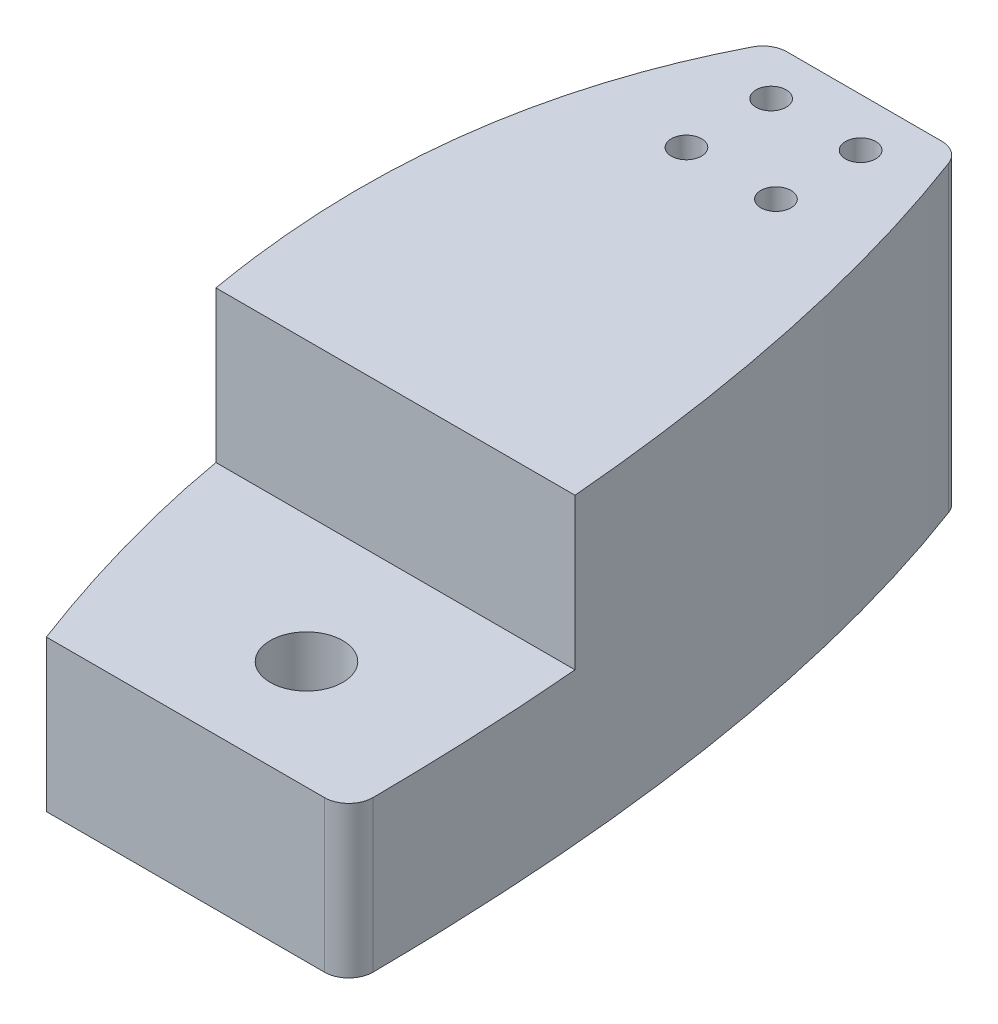
ISO-10303-21;
HEADER;
FILE_DESCRIPTION(('STEP AP214'),'2;1');
FILE_NAME('part.step','',(''),(''),'','','');
FILE_SCHEMA(('AUTOMOTIVE_DESIGN { 1 0 10303 214 1 1 1 1 }'));
ENDSEC;
DATA;
#1=APPLICATION_CONTEXT('core data for automotive mechanical design processes');
#2=APPLICATION_PROTOCOL_DEFINITION('international standard','automotive_design',2000,#1);
#3=PRODUCT_CONTEXT('',#1,'mechanical');
#4=PRODUCT('Part','Part','',(#3));
#5=PRODUCT_RELATED_PRODUCT_CATEGORY('part','',(#4));
#6=PRODUCT_DEFINITION_FORMATION('','',#4);
#7=PRODUCT_DEFINITION_CONTEXT('part definition',#1,'design');
#8=PRODUCT_DEFINITION('design','',#6,#7);
#9=PRODUCT_DEFINITION_SHAPE('','',#8);
#10=(LENGTH_UNIT() NAMED_UNIT(*) SI_UNIT(.MILLI.,.METRE.));
#11=(NAMED_UNIT(*) PLANE_ANGLE_UNIT() SI_UNIT($,.RADIAN.));
#12=(NAMED_UNIT(*) SI_UNIT($,.STERADIAN.) SOLID_ANGLE_UNIT());
#13=UNCERTAINTY_MEASURE_WITH_UNIT(LENGTH_MEASURE(1.E-05),#10,'distance_accuracy_value','');
#14=(GEOMETRIC_REPRESENTATION_CONTEXT(3) GLOBAL_UNCERTAINTY_ASSIGNED_CONTEXT((#13)) GLOBAL_UNIT_ASSIGNED_CONTEXT((#10,
#11,#12)) REPRESENTATION_CONTEXT('',''));
#15=CARTESIAN_POINT('',(0.,0.,0.));
#16=DIRECTION('',(0.,0.,1.));
#17=DIRECTION('',(1.,0.,0.));
#18=AXIS2_PLACEMENT_3D('',#15,#16,#17);
#19=CARTESIAN_POINT('',(0.,0.,0.));
#20=DIRECTION('',(0.,0.,-1.));
#21=DIRECTION('',(-1.,0.,0.));
#22=AXIS2_PLACEMENT_3D('',#19,#20,#21);
#23=PLANE('',#22);
#24=DIRECTION('',(1.,0.,0.));
#25=VECTOR('',#24,1.);
#26=CARTESIAN_POINT('',(-12.5,12.5,0.));
#27=LINE('',#26,#25);
#28=CARTESIAN_POINT('',(-11.2929010343161,12.5,0.));
#29=VERTEX_POINT('',#28);
#30=CARTESIAN_POINT('',(1.50248658975392,12.5,0.));
#31=VERTEX_POINT('',#30);
#32=EDGE_CURVE('E402',#29,#31,#27,.T.);
#33=ORIENTED_EDGE('',*,*,#32,.T.);
#34=DIRECTION('',(0.,-1.,0.));
#35=VECTOR('',#34,1.);
#36=CARTESIAN_POINT('',(1.50248658975392,-12.5,0.));
#37=LINE('',#36,#35);
#38=CARTESIAN_POINT('',(1.50248658975392,-12.5,0.));
#39=VERTEX_POINT('',#38);
#40=EDGE_CURVE('E457',#31,#39,#37,.T.);
#41=ORIENTED_EDGE('',*,*,#40,.T.);
#42=DIRECTION('',(1.,0.,0.));
#43=VECTOR('',#42,1.);
#44=CARTESIAN_POINT('',(-12.5,-12.5,0.));
#45=LINE('',#44,#43);
#46=CARTESIAN_POINT('',(-11.2929010343161,-12.5,0.));
#47=VERTEX_POINT('',#46);
#48=EDGE_CURVE('E418',#47,#39,#45,.T.);
#49=ORIENTED_EDGE('',*,*,#48,.F.);
#50=DIRECTION('',(0.,1.,0.));
#51=VECTOR('',#50,1.);
#52=CARTESIAN_POINT('',(-11.2929010343161,0.,0.));
#53=LINE('',#52,#51);
#54=EDGE_CURVE('E453',#47,#29,#53,.T.);
#55=ORIENTED_EDGE('',*,*,#54,.T.);
#56=EDGE_LOOP('',(#33,#41,#49,#55));
#57=FACE_BOUND('',#56,.T.);
#58=DIRECTION('',(1.,0.,0.));
#59=VECTOR('',#58,1.);
#60=CARTESIAN_POINT('',(0.,8.5,0.));
#61=LINE('',#60,#59);
#62=CARTESIAN_POINT('',(-10.2929010343161,8.5,0.));
#63=VERTEX_POINT('',#62);
#64=CARTESIAN_POINT('',(-6.89520722228111,8.5,0.));
#65=VERTEX_POINT('',#64);
#66=EDGE_CURVE('E319',#63,#65,#61,.T.);
#67=ORIENTED_EDGE('',*,*,#66,.F.);
#68=DIRECTION('',(0.,-1.,0.));
#69=VECTOR('',#68,1.);
#70=CARTESIAN_POINT('',(-10.2929010343161,0.,0.));
#71=LINE('',#70,#69);
#72=CARTESIAN_POINT('',(-10.2929010343161,-8.5,0.));
#73=VERTEX_POINT('',#72);
#74=EDGE_CURVE('E315',#63,#73,#71,.T.);
#75=ORIENTED_EDGE('',*,*,#74,.T.);
#76=DIRECTION('',(1.,0.,0.));
#77=VECTOR('',#76,1.);
#78=CARTESIAN_POINT('',(0.,-8.5,0.));
#79=LINE('',#78,#77);
#80=CARTESIAN_POINT('',(-6.89520722228111,-8.5,0.));
#81=VERTEX_POINT('',#80);
#82=EDGE_CURVE('E303',#73,#81,#79,.T.);
#83=ORIENTED_EDGE('',*,*,#82,.T.);
#84=DIRECTION('',(0.,-1.,0.));
#85=VECTOR('',#84,1.);
#86=CARTESIAN_POINT('',(-6.89520722228111,0.,0.));
#87=LINE('',#86,#85);
#88=EDGE_CURVE('E324',#65,#81,#87,.T.);
#89=ORIENTED_EDGE('',*,*,#88,.F.);
#90=EDGE_LOOP('',(#67,#75,#83,#89));
#91=FACE_BOUND('',#90,.T.);
#92=DIRECTION('',(0.,-1.,0.));
#93=VECTOR('',#92,1.);
#94=CARTESIAN_POINT('',(0.502486589753918,0.,0.));
#95=LINE('',#94,#93);
#96=CARTESIAN_POINT('',(0.502486589753918,8.5,0.));
#97=VERTEX_POINT('',#96);
#98=CARTESIAN_POINT('',(0.502486589753918,-8.5,0.));
#99=VERTEX_POINT('',#98);
#100=EDGE_CURVE('E278',#97,#99,#95,.T.);
#101=ORIENTED_EDGE('',*,*,#100,.F.);
#102=DIRECTION('',(-1.,0.,0.));
#103=VECTOR('',#102,1.);
#104=CARTESIAN_POINT('',(0.,8.5,0.));
#105=LINE('',#104,#103);
#106=CARTESIAN_POINT('',(-2.89520722228112,8.5,0.));
#107=VERTEX_POINT('',#106);
#108=EDGE_CURVE('E248',#97,#107,#105,.T.);
#109=ORIENTED_EDGE('',*,*,#108,.T.);
#110=DIRECTION('',(0.,-1.,0.));
#111=VECTOR('',#110,1.);
#112=CARTESIAN_POINT('',(-2.89520722228112,0.,0.));
#113=LINE('',#112,#111);
#114=CARTESIAN_POINT('',(-2.89520722228112,-8.5,0.));
#115=VERTEX_POINT('',#114);
#116=EDGE_CURVE('E263',#107,#115,#113,.T.);
#117=ORIENTED_EDGE('',*,*,#116,.T.);
#118=DIRECTION('',(-1.,0.,0.));
#119=VECTOR('',#118,1.);
#120=CARTESIAN_POINT('',(0.,-8.5,0.));
#121=LINE('',#120,#119);
#122=EDGE_CURVE('E282',#99,#115,#121,.T.);
#123=ORIENTED_EDGE('',*,*,#122,.F.);
#124=EDGE_LOOP('',(#101,#109,#117,#123));
#125=FACE_BOUND('',#124,.T.);
#126=ADVANCED_FACE('F121',(#57,#91,#125),#23,.T.);
#127=CARTESIAN_POINT('',(-12.5,12.5,60.));
#128=DIRECTION('',(0.,1.,0.));
#129=DIRECTION('',(0.,0.,1.));
#130=AXIS2_PLACEMENT_3D('',#127,#128,#129);
#131=PLANE('',#130);
#132=CARTESIAN_POINT('',(-1.1963603162636,12.5,11.));
#133=DIRECTION('',(0.,1.,0.));
#134=DIRECTION('',(0.,0.,1.));
#135=AXIS2_PLACEMENT_3D('',#132,#133,#134);
#136=CIRCLE('',#135,1.25);
#137=CARTESIAN_POINT('',(-1.1963603162636,12.5,12.25));
#138=VERTEX_POINT('',#137);
#139=EDGE_CURVE('E486',#138,#138,#136,.F.);
#140=ORIENTED_EDGE('',*,*,#139,.T.);
#141=EDGE_LOOP('',(#140));
#142=FACE_BOUND('',#141,.T.);
#143=CARTESIAN_POINT('',(-8.59405412829863,12.5,4.));
#144=DIRECTION('',(0.,1.,0.));
#145=DIRECTION('',(0.,0.,1.));
#146=AXIS2_PLACEMENT_3D('',#143,#144,#145);
#147=CIRCLE('',#146,1.25);
#148=CARTESIAN_POINT('',(-8.59405412829863,12.5,5.25));
#149=VERTEX_POINT('',#148);
#150=EDGE_CURVE('E320',#149,#149,#147,.F.);
#151=ORIENTED_EDGE('',*,*,#150,.T.);
#152=EDGE_LOOP('',(#151));
#153=FACE_BOUND('',#152,.T.);
#154=CARTESIAN_POINT('',(-8.59405412829863,12.5,11.));
#155=DIRECTION('',(0.,1.,0.));
#156=DIRECTION('',(0.,0.,1.));
#157=AXIS2_PLACEMENT_3D('',#154,#155,#156);
#158=CIRCLE('',#157,1.25);
#159=CARTESIAN_POINT('',(-8.59405412829863,12.5,12.25));
#160=VERTEX_POINT('',#159);
#161=EDGE_CURVE('E492',#160,#160,#158,.F.);
#162=ORIENTED_EDGE('',*,*,#161,.T.);
#163=EDGE_LOOP('',(#162));
#164=FACE_BOUND('',#163,.T.);
#165=CARTESIAN_POINT('',(-1.1963603162636,12.5,4.));
#166=DIRECTION('',(0.,1.,0.));
#167=DIRECTION('',(0.,0.,1.));
#168=AXIS2_PLACEMENT_3D('',#165,#166,#167);
#169=CIRCLE('',#168,1.25);
#170=CARTESIAN_POINT('',(-1.1963603162636,12.5,5.25));
#171=VERTEX_POINT('',#170);
#172=EDGE_CURVE('E480',#171,#171,#169,.F.);
#173=ORIENTED_EDGE('',*,*,#172,.T.);
#174=EDGE_LOOP('',(#173));
#175=FACE_BOUND('',#174,.T.);
#176=CARTESIAN_POINT('',(2.87897961386818,12.5,0.));
#177=CARTESIAN_POINT('',(12.5,12.5,24.6971319421463));
#178=CARTESIAN_POINT('',(12.5,12.5,60.));
#179=B_SPLINE_CURVE_WITH_KNOTS('',2,(#176,#177,#178),.UNSPECIFIED.,.F.,.F.,(3,3),(0.,1.),.UNSPECIFIED.);
#180=CARTESIAN_POINT('',(3.37503650721397,12.5,1.29746401756182));
#181=VERTEX_POINT('',#180);
#182=CARTESIAN_POINT('',(11.698102629454,12.5,40.5));
#183=VERTEX_POINT('',#182);
#184=EDGE_CURVE('E366',#181,#183,#179,.T.);
#185=ORIENTED_EDGE('',*,*,#184,.F.);
#186=CARTESIAN_POINT('',(1.50248658975392,12.5,2.));
#187=DIRECTION('',(0.,1.,0.));
#188=DIRECTION('',(0.,0.,1.));
#189=AXIS2_PLACEMENT_3D('',#186,#187,#188);
#190=CIRCLE('',#189,2.);
#191=EDGE_CURVE('E450',#181,#31,#190,.T.);
#192=ORIENTED_EDGE('',*,*,#191,.T.);
#193=ORIENTED_EDGE('',*,*,#32,.F.);
#194=CARTESIAN_POINT('',(-11.2929010343161,12.5,2.));
#195=DIRECTION('',(0.,1.,0.));
#196=DIRECTION('',(0.,0.,1.));
#197=AXIS2_PLACEMENT_3D('',#194,#195,#196);
#198=CIRCLE('',#197,2.);
#199=CARTESIAN_POINT('',(-13.0728961441656,12.5,1.08806940564981));
#200=VERTEX_POINT('',#199);
#201=EDGE_CURVE('E447',#29,#200,#198,.T.);
#202=ORIENTED_EDGE('',*,*,#201,.T.);
#203=CARTESIAN_POINT('',(-12.5,12.5,0.));
#204=CARTESIAN_POINT('',(-25.857752506095,12.5,24.6971319421463));
#205=CARTESIAN_POINT('',(-12.5,12.5,60.));
#206=B_SPLINE_CURVE_WITH_KNOTS('',2,(#203,#204,#205),.UNSPECIFIED.,.F.,.F.,(3,3),(0.,1.),.UNSPECIFIED.);
#207=CARTESIAN_POINT('',(-17.986106002808,12.5,40.5));
#208=VERTEX_POINT('',#207);
#209=EDGE_CURVE('E376',#200,#208,#206,.T.);
#210=ORIENTED_EDGE('',*,*,#209,.T.);
#211=DIRECTION('',(-1.,0.,0.));
#212=VECTOR('',#211,1.);
#213=CARTESIAN_POINT('',(18.7881167987811,12.5,40.5));
#214=LINE('',#213,#212);
#215=EDGE_CURVE('E348',#183,#208,#214,.T.);
#216=ORIENTED_EDGE('',*,*,#215,.F.);
#217=EDGE_LOOP('',(#185,#192,#193,#202,#210,#216));
#218=FACE_BOUND('',#217,.T.);
#219=ADVANCED_FACE('F507',(#142,#153,#164,#175,#218),#131,.T.);
#220=CARTESIAN_POINT('',(-12.5,-12.5,60.));
#221=DIRECTION('',(0.,1.,0.));
#222=DIRECTION('',(0.,0.,1.));
#223=AXIS2_PLACEMENT_3D('',#220,#221,#222);
#224=PLANE('',#223);
#225=CARTESIAN_POINT('',(-1.1963603162636,-12.5,11.));
#226=DIRECTION('',(0.,1.,0.));
#227=DIRECTION('',(0.,0.,1.));
#228=AXIS2_PLACEMENT_3D('',#225,#226,#227);
#229=CIRCLE('',#228,1.25);
#230=CARTESIAN_POINT('',(-1.1963603162636,-12.5,12.25));
#231=VERTEX_POINT('',#230);
#232=EDGE_CURVE('E835',#231,#231,#229,.F.);
#233=ORIENTED_EDGE('',*,*,#232,.F.);
#234=EDGE_LOOP('',(#233));
#235=FACE_BOUND('',#234,.T.);
#236=CARTESIAN_POINT('',(-8.59405412829863,-12.5,4.));
#237=DIRECTION('',(0.,1.,0.));
#238=DIRECTION('',(0.,0.,1.));
#239=AXIS2_PLACEMENT_3D('',#236,#237,#238);
#240=CIRCLE('',#239,1.25);
#241=CARTESIAN_POINT('',(-8.59405412829863,-12.5,5.25));
#242=VERTEX_POINT('',#241);
#243=EDGE_CURVE('E813',#242,#242,#240,.F.);
#244=ORIENTED_EDGE('',*,*,#243,.F.);
#245=EDGE_LOOP('',(#244));
#246=FACE_BOUND('',#245,.T.);
#247=CARTESIAN_POINT('',(-8.59405412829863,-12.5,11.));
#248=DIRECTION('',(0.,1.,0.));
#249=DIRECTION('',(0.,0.,1.));
#250=AXIS2_PLACEMENT_3D('',#247,#248,#249);
#251=CIRCLE('',#250,1.25);
#252=CARTESIAN_POINT('',(-8.59405412829863,-12.5,12.25));
#253=VERTEX_POINT('',#252);
#254=EDGE_CURVE('E825',#253,#253,#251,.F.);
#255=ORIENTED_EDGE('',*,*,#254,.F.);
#256=EDGE_LOOP('',(#255));
#257=FACE_BOUND('',#256,.T.);
#258=CARTESIAN_POINT('',(-1.1963603162636,-12.5,4.));
#259=DIRECTION('',(0.,1.,0.));
#260=DIRECTION('',(0.,0.,1.));
#261=AXIS2_PLACEMENT_3D('',#258,#259,#260);
#262=CIRCLE('',#261,1.25);
#263=CARTESIAN_POINT('',(-1.1963603162636,-12.5,5.25));
#264=VERTEX_POINT('',#263);
#265=EDGE_CURVE('E845',#264,#264,#262,.F.);
#266=ORIENTED_EDGE('',*,*,#265,.F.);
#267=EDGE_LOOP('',(#266));
#268=FACE_BOUND('',#267,.T.);
#269=CARTESIAN_POINT('',(0.,-12.5,51.));
#270=DIRECTION('',(0.,1.,0.));
#271=DIRECTION('',(0.,0.,1.));
#272=AXIS2_PLACEMENT_3D('',#269,#270,#271);
#273=CIRCLE('',#272,3.);
#274=CARTESIAN_POINT('',(0.,-12.5,54.));
#275=VERTEX_POINT('',#274);
#276=EDGE_CURVE('E343',#275,#275,#273,.T.);
#277=ORIENTED_EDGE('',*,*,#276,.T.);
#278=EDGE_LOOP('',(#277));
#279=FACE_BOUND('',#278,.T.);
#280=CARTESIAN_POINT('',(2.87897961386818,-12.5,0.));
#281=CARTESIAN_POINT('',(12.5,-12.5,24.6971319421463));
#282=CARTESIAN_POINT('',(12.5,-12.5,60.));
#283=B_SPLINE_CURVE_WITH_KNOTS('',2,(#280,#281,#282),.UNSPECIFIED.,.F.,.F.,(3,3),(0.,1.),.UNSPECIFIED.);
#284=CARTESIAN_POINT('',(3.37503650721397,-12.5,1.29746401756182));
#285=VERTEX_POINT('',#284);
#286=CARTESIAN_POINT('',(12.4920901269706,-12.5,57.9842362674177));
#287=VERTEX_POINT('',#286);
#288=EDGE_CURVE('E367',#285,#287,#283,.T.);
#289=ORIENTED_EDGE('',*,*,#288,.T.);
#290=CARTESIAN_POINT('',(10.4921522517517,-12.5,58.));
#291=DIRECTION('',(0.,1.,0.));
#292=DIRECTION('',(0.,0.,1.));
#293=AXIS2_PLACEMENT_3D('',#290,#291,#292);
#294=CIRCLE('',#293,2.);
#295=CARTESIAN_POINT('',(10.4921522517517,-12.5,60.));
#296=VERTEX_POINT('',#295);
#297=EDGE_CURVE('E13',#287,#296,#294,.F.);
#298=ORIENTED_EDGE('',*,*,#297,.T.);
#299=DIRECTION('',(1.,0.,0.));
#300=VECTOR('',#299,1.);
#301=CARTESIAN_POINT('',(-12.5,-12.5,60.));
#302=LINE('',#301,#300);
#303=CARTESIAN_POINT('',(-12.5,-12.5,60.));
#304=VERTEX_POINT('',#303);
#305=EDGE_CURVE('E417',#304,#296,#302,.T.);
#306=ORIENTED_EDGE('',*,*,#305,.F.);
#307=CARTESIAN_POINT('',(-12.5,-12.5,0.));
#308=CARTESIAN_POINT('',(-25.857752506095,-12.5,24.6971319421463));
#309=CARTESIAN_POINT('',(-12.5,-12.5,60.));
#310=B_SPLINE_CURVE_WITH_KNOTS('',2,(#307,#308,#309),.UNSPECIFIED.,.F.,.F.,(3,3),(0.,1.),.UNSPECIFIED.);
#311=CARTESIAN_POINT('',(-13.0728961441656,-12.5,1.08806940564982));
#312=VERTEX_POINT('',#311);
#313=EDGE_CURVE('E396',#312,#304,#310,.T.);
#314=ORIENTED_EDGE('',*,*,#313,.F.);
#315=CARTESIAN_POINT('',(-11.2929010343161,-12.5,2.));
#316=DIRECTION('',(0.,1.,0.));
#317=DIRECTION('',(0.,0.,1.));
#318=AXIS2_PLACEMENT_3D('',#315,#316,#317);
#319=CIRCLE('',#318,2.);
#320=EDGE_CURVE('E460',#312,#47,#319,.F.);
#321=ORIENTED_EDGE('',*,*,#320,.T.);
#322=ORIENTED_EDGE('',*,*,#48,.T.);
#323=CARTESIAN_POINT('',(1.50248658975392,-12.5,2.));
#324=DIRECTION('',(0.,1.,0.));
#325=DIRECTION('',(0.,0.,1.));
#326=AXIS2_PLACEMENT_3D('',#323,#324,#325);
#327=CIRCLE('',#326,2.);
#328=EDGE_CURVE('E463',#39,#285,#327,.F.);
#329=ORIENTED_EDGE('',*,*,#328,.T.);
#330=EDGE_LOOP('',(#289,#298,#306,#314,#321,#322,#329));
#331=FACE_BOUND('',#330,.T.);
#332=ADVANCED_FACE('F519',(#235,#246,#257,#268,#279,#331),#224,.F.);
#333=CARTESIAN_POINT('',(0.,0.,60.));
#334=DIRECTION('',(0.,0.,-1.));
#335=DIRECTION('',(-1.,0.,0.));
#336=AXIS2_PLACEMENT_3D('',#333,#334,#335);
#337=PLANE('',#336);
#338=ORIENTED_EDGE('',*,*,#305,.T.);
#339=DIRECTION('',(0.,1.,0.));
#340=VECTOR('',#339,1.);
#341=CARTESIAN_POINT('',(10.4921522517517,0.,60.));
#342=LINE('',#341,#340);
#343=CARTESIAN_POINT('',(10.4921522517517,0.,60.));
#344=VERTEX_POINT('',#343);
#345=EDGE_CURVE('E469',#296,#344,#342,.T.);
#346=ORIENTED_EDGE('',*,*,#345,.T.);
#347=DIRECTION('',(1.,0.,0.));
#348=VECTOR('',#347,1.);
#349=CARTESIAN_POINT('',(18.7881167987811,0.,60.));
#350=LINE('',#349,#348);
#351=CARTESIAN_POINT('',(-12.5,0.,60.));
#352=VERTEX_POINT('',#351);
#353=EDGE_CURVE('E347',#352,#344,#350,.T.);
#354=ORIENTED_EDGE('',*,*,#353,.F.);
#355=DIRECTION('',(0.,1.,0.));
#356=VECTOR('',#355,1.);
#357=CARTESIAN_POINT('',(-12.5,-12.5,60.));
#358=LINE('',#357,#356);
#359=EDGE_CURVE('E410',#304,#352,#358,.T.);
#360=ORIENTED_EDGE('',*,*,#359,.F.);
#361=EDGE_LOOP('',(#338,#346,#354,#360));
#362=FACE_BOUND('',#361,.T.);
#363=ADVANCED_FACE('F393',(#362),#337,.F.);
#364=DIRECTION('',(0.,1.,0.));
#365=VECTOR('',#364,1.);
#366=SURFACE_OF_LINEAR_EXTRUSION('',#310,#365);
#367=ORIENTED_EDGE('',*,*,#209,.F.);
#368=DIRECTION('',(0.,1.,0.));
#369=VECTOR('',#368,1.);
#370=CARTESIAN_POINT('',(-13.0728961441656,12.5,1.08806940564981));
#371=LINE('',#370,#369);
#372=EDGE_CURVE('E466',#200,#312,#371,.F.);
#373=ORIENTED_EDGE('',*,*,#372,.T.);
#374=ORIENTED_EDGE('',*,*,#313,.T.);
#375=ORIENTED_EDGE('',*,*,#359,.T.);
#376=CARTESIAN_POINT('',(-12.5,0.,0.));
#377=CARTESIAN_POINT('',(-25.857752506095,0.,24.6971319421463));
#378=CARTESIAN_POINT('',(-12.5,0.,60.));
#379=B_SPLINE_CURVE_WITH_KNOTS('',2,(#376,#377,#378),.UNSPECIFIED.,.F.,.F.,(3,3),(0.,1.),.UNSPECIFIED.);
#380=CARTESIAN_POINT('',(-17.986106002808,0.,40.5));
#381=VERTEX_POINT('',#380);
#382=EDGE_CURVE('E361',#381,#352,#379,.T.);
#383=ORIENTED_EDGE('',*,*,#382,.F.);
#384=DIRECTION('',(0.,1.,0.));
#385=VECTOR('',#384,1.);
#386=CARTESIAN_POINT('',(-17.986106002808,-12.5,40.5));
#387=LINE('',#386,#385);
#388=EDGE_CURVE('E355',#381,#208,#387,.T.);
#389=ORIENTED_EDGE('',*,*,#388,.T.);
#390=EDGE_LOOP('',(#367,#373,#374,#375,#383,#389));
#391=FACE_BOUND('',#390,.T.);
#392=ADVANCED_FACE('F389',(#391),#366,.T.);
#393=DIRECTION('',(0.,1.,0.));
#394=VECTOR('',#393,1.);
#395=SURFACE_OF_LINEAR_EXTRUSION('',#283,#394);
#396=CARTESIAN_POINT('',(2.87897961386818,0.,0.));
#397=CARTESIAN_POINT('',(12.5,0.,24.6971319421463));
#398=CARTESIAN_POINT('',(12.5,0.,60.));
#399=B_SPLINE_CURVE_WITH_KNOTS('',2,(#396,#397,#398),.UNSPECIFIED.,.F.,.F.,(3,3),(0.,1.),.UNSPECIFIED.);
#400=CARTESIAN_POINT('',(11.698102629454,0.,40.5));
#401=VERTEX_POINT('',#400);
#402=CARTESIAN_POINT('',(12.4920901269706,0.,57.9842362674177));
#403=VERTEX_POINT('',#402);
#404=EDGE_CURVE('E432',#401,#403,#399,.T.);
#405=ORIENTED_EDGE('',*,*,#404,.T.);
#406=DIRECTION('',(0.,1.,0.));
#407=VECTOR('',#406,1.);
#408=CARTESIAN_POINT('',(12.4920901269706,0.,57.9842362674176));
#409=LINE('',#408,#407);
#410=EDGE_CURVE('E130',#403,#287,#409,.F.);
#411=ORIENTED_EDGE('',*,*,#410,.T.);
#412=ORIENTED_EDGE('',*,*,#288,.F.);
#413=DIRECTION('',(0.,1.,0.));
#414=VECTOR('',#413,1.);
#415=CARTESIAN_POINT('',(3.37503650721396,-12.5,1.29746401756181));
#416=LINE('',#415,#414);
#417=EDGE_CURVE('E437',#285,#181,#416,.T.);
#418=ORIENTED_EDGE('',*,*,#417,.T.);
#419=ORIENTED_EDGE('',*,*,#184,.T.);
#420=DIRECTION('',(0.,1.,0.));
#421=VECTOR('',#420,1.);
#422=CARTESIAN_POINT('',(11.698102629454,-12.5,40.5));
#423=LINE('',#422,#421);
#424=EDGE_CURVE('E422',#401,#183,#423,.T.);
#425=ORIENTED_EDGE('',*,*,#424,.F.);
#426=EDGE_LOOP('',(#405,#411,#412,#418,#419,#425));
#427=FACE_BOUND('',#426,.T.);
#428=ADVANCED_FACE('F384',(#427),#395,.F.);
#429=CARTESIAN_POINT('',(18.7881167987811,0.,40.5));
#430=DIRECTION('',(0.,-1.,0.));
#431=DIRECTION('',(1.,0.,0.));
#432=AXIS2_PLACEMENT_3D('',#429,#430,#431);
#433=PLANE('',#432);
#434=CARTESIAN_POINT('',(0.,0.,51.));
#435=DIRECTION('',(0.,-1.,0.));
#436=DIRECTION('',(1.,0.,0.));
#437=AXIS2_PLACEMENT_3D('',#434,#435,#436);
#438=CIRCLE('',#437,3.);
#439=CARTESIAN_POINT('',(3.,0.,51.));
#440=VERTEX_POINT('',#439);
#441=EDGE_CURVE('E292',#440,#440,#438,.T.);
#442=ORIENTED_EDGE('',*,*,#441,.T.);
#443=EDGE_LOOP('',(#442));
#444=FACE_BOUND('',#443,.T.);
#445=ORIENTED_EDGE('',*,*,#353,.T.);
#446=CARTESIAN_POINT('',(10.4921522517517,0.,58.));
#447=DIRECTION('',(0.,-1.,0.));
#448=DIRECTION('',(1.,0.,0.));
#449=AXIS2_PLACEMENT_3D('',#446,#447,#448);
#450=CIRCLE('',#449,2.);
#451=EDGE_CURVE('E144',#344,#403,#450,.F.);
#452=ORIENTED_EDGE('',*,*,#451,.T.);
#453=ORIENTED_EDGE('',*,*,#404,.F.);
#454=DIRECTION('',(1.,0.,0.));
#455=VECTOR('',#454,1.);
#456=CARTESIAN_POINT('',(18.7881167987811,0.,40.5));
#457=LINE('',#456,#455);
#458=EDGE_CURVE('E352',#381,#401,#457,.T.);
#459=ORIENTED_EDGE('',*,*,#458,.F.);
#460=ORIENTED_EDGE('',*,*,#382,.T.);
#461=EDGE_LOOP('',(#445,#452,#453,#459,#460));
#462=FACE_BOUND('',#461,.T.);
#463=ADVANCED_FACE('F388',(#444,#462),#433,.F.);
#464=CARTESIAN_POINT('',(0.,0.,40.5));
#465=DIRECTION('',(0.,0.,1.));
#466=DIRECTION('',(1.,0.,0.));
#467=AXIS2_PLACEMENT_3D('',#464,#465,#466);
#468=PLANE('',#467);
#469=ORIENTED_EDGE('',*,*,#458,.T.);
#470=ORIENTED_EDGE('',*,*,#424,.T.);
#471=ORIENTED_EDGE('',*,*,#215,.T.);
#472=ORIENTED_EDGE('',*,*,#388,.F.);
#473=EDGE_LOOP('',(#469,#470,#471,#472));
#474=FACE_BOUND('',#473,.T.);
#475=ADVANCED_FACE('F505',(#474),#468,.T.);
#476=CARTESIAN_POINT('',(0.,-23.9068454263108,51.));
#477=DIRECTION('',(0.,1.,0.));
#478=DIRECTION('',(0.,0.,1.));
#479=AXIS2_PLACEMENT_3D('',#476,#477,#478);
#480=CYLINDRICAL_SURFACE('',#479,3.);
#481=ORIENTED_EDGE('',*,*,#441,.F.);
#482=EDGE_LOOP('',(#481));
#483=FACE_BOUND('',#482,.T.);
#484=ORIENTED_EDGE('',*,*,#276,.F.);
#485=EDGE_LOOP('',(#484));
#486=FACE_BOUND('',#485,.T.);
#487=ADVANCED_FACE('F539',(#483,#486),#480,.F.);
#488=CARTESIAN_POINT('',(1.50248658975392,0.,2.));
#489=DIRECTION('',(0.,1.,0.));
#490=DIRECTION('',(0.,0.,1.));
#491=AXIS2_PLACEMENT_3D('',#488,#489,#490);
#492=CYLINDRICAL_SURFACE('',#491,2.);
#493=ORIENTED_EDGE('',*,*,#328,.F.);
#494=ORIENTED_EDGE('',*,*,#40,.F.);
#495=ORIENTED_EDGE('',*,*,#191,.F.);
#496=ORIENTED_EDGE('',*,*,#417,.F.);
#497=EDGE_LOOP('',(#493,#494,#495,#496));
#498=FACE_BOUND('',#497,.T.);
#499=ADVANCED_FACE('F526',(#498),#492,.T.);
#500=CARTESIAN_POINT('',(-11.2929010343161,0.,2.));
#501=DIRECTION('',(0.,1.,0.));
#502=DIRECTION('',(0.,0.,1.));
#503=AXIS2_PLACEMENT_3D('',#500,#501,#502);
#504=CYLINDRICAL_SURFACE('',#503,2.);
#505=ORIENTED_EDGE('',*,*,#320,.F.);
#506=ORIENTED_EDGE('',*,*,#372,.F.);
#507=ORIENTED_EDGE('',*,*,#201,.F.);
#508=ORIENTED_EDGE('',*,*,#54,.F.);
#509=EDGE_LOOP('',(#505,#506,#507,#508));
#510=FACE_BOUND('',#509,.T.);
#511=ADVANCED_FACE('F515',(#510),#504,.T.);
#512=CARTESIAN_POINT('',(-10.2929010343161,0.,15.));
#513=DIRECTION('',(1.,0.,0.));
#514=DIRECTION('',(0.,0.,-1.));
#515=AXIS2_PLACEMENT_3D('',#512,#513,#514);
#516=PLANE('',#515);
#517=ORIENTED_EDGE('',*,*,#74,.F.);
#518=DIRECTION('',(0.,0.,-1.));
#519=VECTOR('',#518,1.);
#520=CARTESIAN_POINT('',(-10.2929010343161,8.5,15.));
#521=LINE('',#520,#519);
#522=CARTESIAN_POINT('',(-10.2929010343161,8.5,15.));
#523=VERTEX_POINT('',#522);
#524=EDGE_CURVE('E314',#523,#63,#521,.T.);
#525=ORIENTED_EDGE('',*,*,#524,.F.);
#526=DIRECTION('',(0.,-1.,0.));
#527=VECTOR('',#526,1.);
#528=CARTESIAN_POINT('',(-10.2929010343161,0.,15.));
#529=LINE('',#528,#527);
#530=CARTESIAN_POINT('',(-10.2929010343161,-8.5,15.));
#531=VERTEX_POINT('',#530);
#532=EDGE_CURVE('E298',#523,#531,#529,.T.);
#533=ORIENTED_EDGE('',*,*,#532,.T.);
#534=DIRECTION('',(0.,0.,-1.));
#535=VECTOR('',#534,1.);
#536=CARTESIAN_POINT('',(-10.2929010343161,-8.5,15.));
#537=LINE('',#536,#535);
#538=EDGE_CURVE('E279',#531,#73,#537,.T.);
#539=ORIENTED_EDGE('',*,*,#538,.T.);
#540=EDGE_LOOP('',(#517,#525,#533,#539));
#541=FACE_BOUND('',#540,.T.);
#542=ADVANCED_FACE('F554',(#541),#516,.T.);
#543=CARTESIAN_POINT('',(0.,-8.5,15.));
#544=DIRECTION('',(0.,1.,0.));
#545=DIRECTION('',(-1.,0.,0.));
#546=AXIS2_PLACEMENT_3D('',#543,#544,#545);
#547=PLANE('',#546);
#548=CARTESIAN_POINT('',(-8.59405412829863,-8.5,4.));
#549=DIRECTION('',(0.,1.,0.));
#550=DIRECTION('',(-1.,0.,0.));
#551=AXIS2_PLACEMENT_3D('',#548,#549,#550);
#552=CIRCLE('',#551,1.25);
#553=CARTESIAN_POINT('',(-9.84405412829863,-8.5,4.));
#554=VERTEX_POINT('',#553);
#555=EDGE_CURVE('E491',#554,#554,#552,.F.);
#556=ORIENTED_EDGE('',*,*,#555,.T.);
#557=EDGE_LOOP('',(#556));
#558=FACE_BOUND('',#557,.T.);
#559=CARTESIAN_POINT('',(-8.59405412829863,-8.5,11.));
#560=DIRECTION('',(0.,1.,0.));
#561=DIRECTION('',(-1.,0.,0.));
#562=AXIS2_PLACEMENT_3D('',#559,#560,#561);
#563=CIRCLE('',#562,1.25);
#564=CARTESIAN_POINT('',(-9.84405412829863,-8.5,11.));
#565=VERTEX_POINT('',#564);
#566=EDGE_CURVE('E485',#565,#565,#563,.F.);
#567=ORIENTED_EDGE('',*,*,#566,.T.);
#568=EDGE_LOOP('',(#567));
#569=FACE_BOUND('',#568,.T.);
#570=ORIENTED_EDGE('',*,*,#82,.F.);
#571=ORIENTED_EDGE('',*,*,#538,.F.);
#572=DIRECTION('',(1.,0.,0.));
#573=VECTOR('',#572,1.);
#574=CARTESIAN_POINT('',(0.,-8.5,15.));
#575=LINE('',#574,#573);
#576=CARTESIAN_POINT('',(-6.89520722228111,-8.5,15.));
#577=VERTEX_POINT('',#576);
#578=EDGE_CURVE('E311',#531,#577,#575,.T.);
#579=ORIENTED_EDGE('',*,*,#578,.T.);
#580=DIRECTION('',(0.,0.,-1.));
#581=VECTOR('',#580,1.);
#582=CARTESIAN_POINT('',(-6.89520722228111,-8.5,15.));
#583=LINE('',#582,#581);
#584=EDGE_CURVE('E334',#577,#81,#583,.T.);
#585=ORIENTED_EDGE('',*,*,#584,.T.);
#586=EDGE_LOOP('',(#570,#571,#579,#585));
#587=FACE_BOUND('',#586,.T.);
#588=ADVANCED_FACE('F557',(#558,#569,#587),#547,.T.);
#589=CARTESIAN_POINT('',(-6.89520722228111,0.,15.));
#590=DIRECTION('',(1.,0.,0.));
#591=DIRECTION('',(0.,0.,-1.));
#592=AXIS2_PLACEMENT_3D('',#589,#590,#591);
#593=PLANE('',#592);
#594=ORIENTED_EDGE('',*,*,#88,.T.);
#595=ORIENTED_EDGE('',*,*,#584,.F.);
#596=DIRECTION('',(0.,-1.,0.));
#597=VECTOR('',#596,1.);
#598=CARTESIAN_POINT('',(-6.89520722228111,0.,15.));
#599=LINE('',#598,#597);
#600=CARTESIAN_POINT('',(-6.89520722228111,8.5,15.));
#601=VERTEX_POINT('',#600);
#602=EDGE_CURVE('E307',#601,#577,#599,.T.);
#603=ORIENTED_EDGE('',*,*,#602,.F.);
#604=DIRECTION('',(0.,0.,-1.));
#605=VECTOR('',#604,1.);
#606=CARTESIAN_POINT('',(-6.89520722228111,8.5,15.));
#607=LINE('',#606,#605);
#608=EDGE_CURVE('E337',#601,#65,#607,.T.);
#609=ORIENTED_EDGE('',*,*,#608,.T.);
#610=EDGE_LOOP('',(#594,#595,#603,#609));
#611=FACE_BOUND('',#610,.T.);
#612=ADVANCED_FACE('F562',(#611),#593,.F.);
#613=CARTESIAN_POINT('',(0.,8.5,15.));
#614=DIRECTION('',(0.,1.,0.));
#615=DIRECTION('',(-1.,0.,0.));
#616=AXIS2_PLACEMENT_3D('',#613,#614,#615);
#617=PLANE('',#616);
#618=CARTESIAN_POINT('',(-8.59405412829863,8.5,4.));
#619=DIRECTION('',(0.,1.,0.));
#620=DIRECTION('',(-1.,0.,0.));
#621=AXIS2_PLACEMENT_3D('',#618,#619,#620);
#622=CIRCLE('',#621,1.25);
#623=CARTESIAN_POINT('',(-9.84405412829863,8.5,4.));
#624=VERTEX_POINT('',#623);
#625=EDGE_CURVE('E487',#624,#624,#622,.F.);
#626=ORIENTED_EDGE('',*,*,#625,.F.);
#627=EDGE_LOOP('',(#626));
#628=FACE_BOUND('',#627,.T.);
#629=CARTESIAN_POINT('',(-8.59405412829863,8.5,11.));
#630=DIRECTION('',(0.,1.,0.));
#631=DIRECTION('',(-1.,0.,0.));
#632=AXIS2_PLACEMENT_3D('',#629,#630,#631);
#633=CIRCLE('',#632,1.25);
#634=CARTESIAN_POINT('',(-9.84405412829863,8.5,11.));
#635=VERTEX_POINT('',#634);
#636=EDGE_CURVE('E481',#635,#635,#633,.F.);
#637=ORIENTED_EDGE('',*,*,#636,.F.);
#638=EDGE_LOOP('',(#637));
#639=FACE_BOUND('',#638,.T.);
#640=ORIENTED_EDGE('',*,*,#66,.T.);
#641=ORIENTED_EDGE('',*,*,#608,.F.);
#642=DIRECTION('',(1.,0.,0.));
#643=VECTOR('',#642,1.);
#644=CARTESIAN_POINT('',(0.,8.5,15.));
#645=LINE('',#644,#643);
#646=EDGE_CURVE('E302',#523,#601,#645,.T.);
#647=ORIENTED_EDGE('',*,*,#646,.F.);
#648=ORIENTED_EDGE('',*,*,#524,.T.);
#649=EDGE_LOOP('',(#640,#641,#647,#648));
#650=FACE_BOUND('',#649,.T.);
#651=ADVANCED_FACE('F567',(#628,#639,#650),#617,.F.);
#652=CARTESIAN_POINT('',(0.,0.,15.));
#653=DIRECTION('',(0.,0.,-1.));
#654=DIRECTION('',(-1.,0.,0.));
#655=AXIS2_PLACEMENT_3D('',#652,#653,#654);
#656=PLANE('',#655);
#657=ORIENTED_EDGE('',*,*,#532,.F.);
#658=ORIENTED_EDGE('',*,*,#646,.T.);
#659=ORIENTED_EDGE('',*,*,#602,.T.);
#660=ORIENTED_EDGE('',*,*,#578,.F.);
#661=EDGE_LOOP('',(#657,#658,#659,#660));
#662=FACE_BOUND('',#661,.T.);
#663=ADVANCED_FACE('F621',(#662),#656,.T.);
#664=CARTESIAN_POINT('',(0.,8.5,15.));
#665=DIRECTION('',(0.,-1.,0.));
#666=DIRECTION('',(0.,0.,-1.));
#667=AXIS2_PLACEMENT_3D('',#664,#665,#666);
#668=PLANE('',#667);
#669=CARTESIAN_POINT('',(-1.1963603162636,8.5,11.));
#670=DIRECTION('',(0.,-1.,0.));
#671=DIRECTION('',(0.,0.,-1.));
#672=AXIS2_PLACEMENT_3D('',#669,#670,#671);
#673=CIRCLE('',#672,1.25);
#674=CARTESIAN_POINT('',(-1.1963603162636,8.5,9.75));
#675=VERTEX_POINT('',#674);
#676=EDGE_CURVE('E479',#675,#675,#673,.F.);
#677=ORIENTED_EDGE('',*,*,#676,.T.);
#678=EDGE_LOOP('',(#677));
#679=FACE_BOUND('',#678,.T.);
#680=CARTESIAN_POINT('',(-1.1963603162636,8.5,4.));
#681=DIRECTION('',(0.,-1.,0.));
#682=DIRECTION('',(0.,0.,-1.));
#683=AXIS2_PLACEMENT_3D('',#680,#681,#682);
#684=CIRCLE('',#683,1.25);
#685=CARTESIAN_POINT('',(-1.1963603162636,8.5,2.75));
#686=VERTEX_POINT('',#685);
#687=EDGE_CURVE('E474',#686,#686,#684,.F.);
#688=ORIENTED_EDGE('',*,*,#687,.T.);
#689=EDGE_LOOP('',(#688));
#690=FACE_BOUND('',#689,.T.);
#691=ORIENTED_EDGE('',*,*,#108,.F.);
#692=DIRECTION('',(0.,0.,-1.));
#693=VECTOR('',#692,1.);
#694=CARTESIAN_POINT('',(0.502486589753918,8.5,15.));
#695=LINE('',#694,#693);
#696=CARTESIAN_POINT('',(0.502486589753918,8.5,15.));
#697=VERTEX_POINT('',#696);
#698=EDGE_CURVE('E241',#697,#97,#695,.T.);
#699=ORIENTED_EDGE('',*,*,#698,.F.);
#700=DIRECTION('',(-1.,0.,0.));
#701=VECTOR('',#700,1.);
#702=CARTESIAN_POINT('',(0.,8.5,15.));
#703=LINE('',#702,#701);
#704=CARTESIAN_POINT('',(-2.89520722228112,8.5,15.));
#705=VERTEX_POINT('',#704);
#706=EDGE_CURVE('E245',#697,#705,#703,.T.);
#707=ORIENTED_EDGE('',*,*,#706,.T.);
#708=DIRECTION('',(0.,0.,-1.));
#709=VECTOR('',#708,1.);
#710=CARTESIAN_POINT('',(-2.89520722228112,8.5,15.));
#711=LINE('',#710,#709);
#712=EDGE_CURVE('E289',#705,#107,#711,.T.);
#713=ORIENTED_EDGE('',*,*,#712,.T.);
#714=EDGE_LOOP('',(#691,#699,#707,#713));
#715=FACE_BOUND('',#714,.T.);
#716=ADVANCED_FACE('F243',(#679,#690,#715),#668,.T.);
#717=CARTESIAN_POINT('',(-2.89520722228112,0.,15.));
#718=DIRECTION('',(1.,0.,0.));
#719=DIRECTION('',(0.,0.,-1.));
#720=AXIS2_PLACEMENT_3D('',#717,#718,#719);
#721=PLANE('',#720);
#722=ORIENTED_EDGE('',*,*,#116,.F.);
#723=ORIENTED_EDGE('',*,*,#712,.F.);
#724=DIRECTION('',(0.,-1.,0.));
#725=VECTOR('',#724,1.);
#726=CARTESIAN_POINT('',(-2.89520722228112,0.,15.));
#727=LINE('',#726,#725);
#728=CARTESIAN_POINT('',(-2.89520722228112,-8.5,15.));
#729=VERTEX_POINT('',#728);
#730=EDGE_CURVE('E255',#705,#729,#727,.T.);
#731=ORIENTED_EDGE('',*,*,#730,.T.);
#732=DIRECTION('',(0.,0.,-1.));
#733=VECTOR('',#732,1.);
#734=CARTESIAN_POINT('',(-2.89520722228112,-8.5,15.));
#735=LINE('',#734,#733);
#736=EDGE_CURVE('E293',#729,#115,#735,.T.);
#737=ORIENTED_EDGE('',*,*,#736,.T.);
#738=EDGE_LOOP('',(#722,#723,#731,#737));
#739=FACE_BOUND('',#738,.T.);
#740=ADVANCED_FACE('F637',(#739),#721,.T.);
#741=CARTESIAN_POINT('',(0.,-8.5,15.));
#742=DIRECTION('',(0.,-1.,0.));
#743=DIRECTION('',(0.,0.,-1.));
#744=AXIS2_PLACEMENT_3D('',#741,#742,#743);
#745=PLANE('',#744);
#746=CARTESIAN_POINT('',(-1.1963603162636,-8.5,11.));
#747=DIRECTION('',(0.,-1.,0.));
#748=DIRECTION('',(0.,0.,-1.));
#749=AXIS2_PLACEMENT_3D('',#746,#747,#748);
#750=CIRCLE('',#749,1.25);
#751=CARTESIAN_POINT('',(-1.1963603162636,-8.5,9.75));
#752=VERTEX_POINT('',#751);
#753=EDGE_CURVE('E475',#752,#752,#750,.F.);
#754=ORIENTED_EDGE('',*,*,#753,.F.);
#755=EDGE_LOOP('',(#754));
#756=FACE_BOUND('',#755,.T.);
#757=CARTESIAN_POINT('',(-1.1963603162636,-8.5,4.));
#758=DIRECTION('',(0.,-1.,0.));
#759=DIRECTION('',(0.,0.,-1.));
#760=AXIS2_PLACEMENT_3D('',#757,#758,#759);
#761=CIRCLE('',#760,1.25);
#762=CARTESIAN_POINT('',(-1.1963603162636,-8.5,2.75));
#763=VERTEX_POINT('',#762);
#764=EDGE_CURVE('E470',#763,#763,#761,.F.);
#765=ORIENTED_EDGE('',*,*,#764,.F.);
#766=EDGE_LOOP('',(#765));
#767=FACE_BOUND('',#766,.T.);
#768=ORIENTED_EDGE('',*,*,#122,.T.);
#769=ORIENTED_EDGE('',*,*,#736,.F.);
#770=DIRECTION('',(-1.,0.,0.));
#771=VECTOR('',#770,1.);
#772=CARTESIAN_POINT('',(0.,-8.5,15.));
#773=LINE('',#772,#771);
#774=CARTESIAN_POINT('',(0.502486589753918,-8.5,15.));
#775=VERTEX_POINT('',#774);
#776=EDGE_CURVE('E268',#775,#729,#773,.T.);
#777=ORIENTED_EDGE('',*,*,#776,.F.);
#778=DIRECTION('',(0.,0.,-1.));
#779=VECTOR('',#778,1.);
#780=CARTESIAN_POINT('',(0.502486589753918,-8.5,15.));
#781=LINE('',#780,#779);
#782=EDGE_CURVE('E254',#775,#99,#781,.T.);
#783=ORIENTED_EDGE('',*,*,#782,.T.);
#784=EDGE_LOOP('',(#768,#769,#777,#783));
#785=FACE_BOUND('',#784,.T.);
#786=ADVANCED_FACE('F646',(#756,#767,#785),#745,.F.);
#787=CARTESIAN_POINT('',(0.502486589753918,0.,15.));
#788=DIRECTION('',(1.,0.,0.));
#789=DIRECTION('',(0.,0.,-1.));
#790=AXIS2_PLACEMENT_3D('',#787,#788,#789);
#791=PLANE('',#790);
#792=ORIENTED_EDGE('',*,*,#100,.T.);
#793=ORIENTED_EDGE('',*,*,#782,.F.);
#794=DIRECTION('',(0.,-1.,0.));
#795=VECTOR('',#794,1.);
#796=CARTESIAN_POINT('',(0.502486589753918,0.,15.));
#797=LINE('',#796,#795);
#798=EDGE_CURVE('E261',#697,#775,#797,.T.);
#799=ORIENTED_EDGE('',*,*,#798,.F.);
#800=ORIENTED_EDGE('',*,*,#698,.T.);
#801=EDGE_LOOP('',(#792,#793,#799,#800));
#802=FACE_BOUND('',#801,.T.);
#803=ADVANCED_FACE('F265',(#802),#791,.F.);
#804=CARTESIAN_POINT('',(0.,0.,15.));
#805=DIRECTION('',(0.,0.,-1.));
#806=DIRECTION('',(-1.,0.,0.));
#807=AXIS2_PLACEMENT_3D('',#804,#805,#806);
#808=PLANE('',#807);
#809=ORIENTED_EDGE('',*,*,#706,.F.);
#810=ORIENTED_EDGE('',*,*,#798,.T.);
#811=ORIENTED_EDGE('',*,*,#776,.T.);
#812=ORIENTED_EDGE('',*,*,#730,.F.);
#813=EDGE_LOOP('',(#809,#810,#811,#812));
#814=FACE_BOUND('',#813,.T.);
#815=ADVANCED_FACE('F259',(#814),#808,.T.);
#816=CARTESIAN_POINT('',(-1.1963603162636,-22.5,4.));
#817=DIRECTION('',(0.,1.,0.));
#818=DIRECTION('',(0.,0.,1.));
#819=AXIS2_PLACEMENT_3D('',#816,#817,#818);
#820=CYLINDRICAL_SURFACE('',#819,1.25);
#821=ORIENTED_EDGE('',*,*,#764,.T.);
#822=EDGE_LOOP('',(#821));
#823=FACE_BOUND('',#822,.T.);
#824=ORIENTED_EDGE('',*,*,#265,.T.);
#825=EDGE_LOOP('',(#824));
#826=FACE_BOUND('',#825,.T.);
#827=ADVANCED_FACE('F670',(#823,#826),#820,.F.);
#828=CARTESIAN_POINT('',(-1.1963603162636,-22.5,11.));
#829=DIRECTION('',(0.,1.,0.));
#830=DIRECTION('',(0.,0.,1.));
#831=AXIS2_PLACEMENT_3D('',#828,#829,#830);
#832=CYLINDRICAL_SURFACE('',#831,1.25);
#833=ORIENTED_EDGE('',*,*,#753,.T.);
#834=EDGE_LOOP('',(#833));
#835=FACE_BOUND('',#834,.T.);
#836=ORIENTED_EDGE('',*,*,#232,.T.);
#837=EDGE_LOOP('',(#836));
#838=FACE_BOUND('',#837,.T.);
#839=ADVANCED_FACE('F680',(#835,#838),#832,.F.);
#840=ORIENTED_EDGE('',*,*,#172,.F.);
#841=EDGE_LOOP('',(#840));
#842=FACE_BOUND('',#841,.T.);
#843=ORIENTED_EDGE('',*,*,#687,.F.);
#844=EDGE_LOOP('',(#843));
#845=FACE_BOUND('',#844,.T.);
#846=ADVANCED_FACE('F683',(#842,#845),#820,.F.);
#847=ORIENTED_EDGE('',*,*,#139,.F.);
#848=EDGE_LOOP('',(#847));
#849=FACE_BOUND('',#848,.T.);
#850=ORIENTED_EDGE('',*,*,#676,.F.);
#851=EDGE_LOOP('',(#850));
#852=FACE_BOUND('',#851,.T.);
#853=ADVANCED_FACE('F692',(#849,#852),#832,.F.);
#854=CARTESIAN_POINT('',(-8.59405412829863,-22.5,11.));
#855=DIRECTION('',(0.,1.,0.));
#856=DIRECTION('',(0.,0.,1.));
#857=AXIS2_PLACEMENT_3D('',#854,#855,#856);
#858=CYLINDRICAL_SURFACE('',#857,1.25);
#859=ORIENTED_EDGE('',*,*,#161,.F.);
#860=EDGE_LOOP('',(#859));
#861=FACE_BOUND('',#860,.T.);
#862=ORIENTED_EDGE('',*,*,#636,.T.);
#863=EDGE_LOOP('',(#862));
#864=FACE_BOUND('',#863,.T.);
#865=ADVANCED_FACE('F706',(#861,#864),#858,.F.);
#866=CARTESIAN_POINT('',(-8.59405412829863,-22.5,4.));
#867=DIRECTION('',(0.,1.,0.));
#868=DIRECTION('',(0.,0.,1.));
#869=AXIS2_PLACEMENT_3D('',#866,#867,#868);
#870=CYLINDRICAL_SURFACE('',#869,1.25);
#871=ORIENTED_EDGE('',*,*,#150,.F.);
#872=EDGE_LOOP('',(#871));
#873=FACE_BOUND('',#872,.T.);
#874=ORIENTED_EDGE('',*,*,#625,.T.);
#875=EDGE_LOOP('',(#874));
#876=FACE_BOUND('',#875,.T.);
#877=ADVANCED_FACE('F714',(#873,#876),#870,.F.);
#878=ORIENTED_EDGE('',*,*,#566,.F.);
#879=EDGE_LOOP('',(#878));
#880=FACE_BOUND('',#879,.T.);
#881=ORIENTED_EDGE('',*,*,#254,.T.);
#882=EDGE_LOOP('',(#881));
#883=FACE_BOUND('',#882,.T.);
#884=ADVANCED_FACE('F717',(#880,#883),#858,.F.);
#885=ORIENTED_EDGE('',*,*,#555,.F.);
#886=EDGE_LOOP('',(#885));
#887=FACE_BOUND('',#886,.T.);
#888=ORIENTED_EDGE('',*,*,#243,.T.);
#889=EDGE_LOOP('',(#888));
#890=FACE_BOUND('',#889,.T.);
#891=ADVANCED_FACE('F726',(#887,#890),#870,.F.);
#892=CARTESIAN_POINT('',(10.4921522517517,-6.25,58.));
#893=DIRECTION('',(0.,1.,0.));
#894=DIRECTION('',(0.,0.,1.));
#895=AXIS2_PLACEMENT_3D('',#892,#893,#894);
#896=CYLINDRICAL_SURFACE('',#895,2.);
#897=ORIENTED_EDGE('',*,*,#297,.F.);
#898=ORIENTED_EDGE('',*,*,#410,.F.);
#899=ORIENTED_EDGE('',*,*,#451,.F.);
#900=ORIENTED_EDGE('',*,*,#345,.F.);
#901=EDGE_LOOP('',(#897,#898,#899,#900));
#902=FACE_BOUND('',#901,.T.);
#903=ADVANCED_FACE('F123',(#902),#896,.T.);
#904=CLOSED_SHELL('',(#126,#219,#332,#363,#392,#428,#463,#475,#487,#499,#511,#542,#588,#612,
#651,#663,#716,#740,#786,#803,#815,#827,#839,#846,#853,#865,#877,#884,#891,#903));
#905=MANIFOLD_SOLID_BREP('B2',#904);
#906=ADVANCED_BREP_SHAPE_REPRESENTATION('',(#18,#905),#14);
#907=SHAPE_DEFINITION_REPRESENTATION(#9,#906);
ENDSEC;
END-ISO-10303-21;
